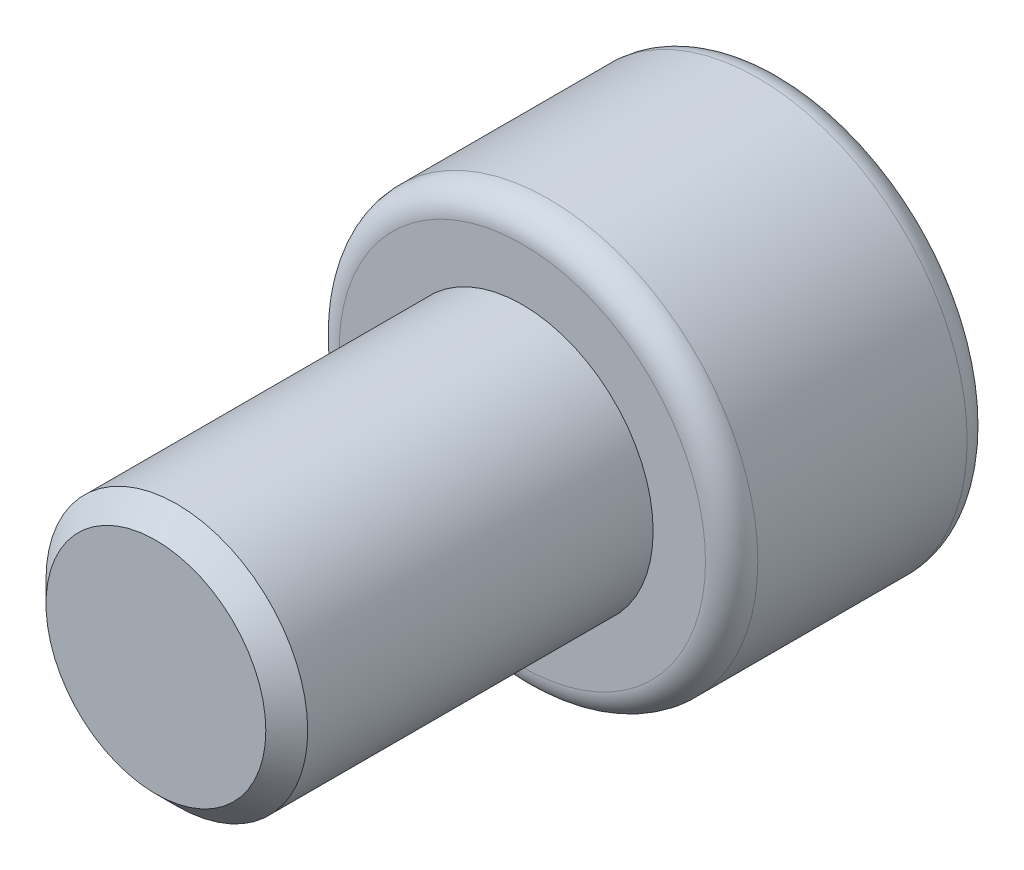
ISO-10303-21;
HEADER;
FILE_DESCRIPTION(('STEP AP214'),'2;1');
FILE_NAME('part.step','',(''),(''),'','','');
FILE_SCHEMA(('AUTOMOTIVE_DESIGN { 1 0 10303 214 1 1 1 1 }'));
ENDSEC;
DATA;
#1=APPLICATION_CONTEXT('core data for automotive mechanical design processes');
#2=APPLICATION_PROTOCOL_DEFINITION('international standard','automotive_design',2000,#1);
#3=PRODUCT_CONTEXT('',#1,'mechanical');
#4=PRODUCT('Part','Part','',(#3));
#5=PRODUCT_RELATED_PRODUCT_CATEGORY('part','',(#4));
#6=PRODUCT_DEFINITION_FORMATION('','',#4);
#7=PRODUCT_DEFINITION_CONTEXT('part definition',#1,'design');
#8=PRODUCT_DEFINITION('design','',#6,#7);
#9=PRODUCT_DEFINITION_SHAPE('','',#8);
#10=(LENGTH_UNIT() NAMED_UNIT(*) SI_UNIT(.MILLI.,.METRE.));
#11=(NAMED_UNIT(*) PLANE_ANGLE_UNIT() SI_UNIT($,.RADIAN.));
#12=(NAMED_UNIT(*) SI_UNIT($,.STERADIAN.) SOLID_ANGLE_UNIT());
#13=UNCERTAINTY_MEASURE_WITH_UNIT(LENGTH_MEASURE(1.E-05),#10,'distance_accuracy_value','');
#14=(GEOMETRIC_REPRESENTATION_CONTEXT(3) GLOBAL_UNCERTAINTY_ASSIGNED_CONTEXT((#13)) GLOBAL_UNIT_ASSIGNED_CONTEXT((#10,
#11,#12)) REPRESENTATION_CONTEXT('',''));
#15=CARTESIAN_POINT('',(0.,0.,0.));
#16=DIRECTION('',(0.,0.,1.));
#17=DIRECTION('',(1.,0.,0.));
#18=AXIS2_PLACEMENT_3D('',#15,#16,#17);
#19=CARTESIAN_POINT('',(0.,0.,5.));
#20=DIRECTION('',(0.,0.,-1.));
#21=DIRECTION('',(-1.,0.,0.));
#22=AXIS2_PLACEMENT_3D('',#19,#20,#21);
#23=CYLINDRICAL_SURFACE('',#22,4.);
#24=CARTESIAN_POINT('',(0.,0.,4.5));
#25=DIRECTION('',(0.,0.,1.));
#26=DIRECTION('',(1.,0.,0.));
#27=AXIS2_PLACEMENT_3D('',#24,#25,#26);
#28=CIRCLE('',#27,4.);
#29=CARTESIAN_POINT('',(4.,0.,4.5));
#30=VERTEX_POINT('',#29);
#31=EDGE_CURVE('E160',#30,#30,#28,.F.);
#32=ORIENTED_EDGE('',*,*,#31,.T.);
#33=EDGE_LOOP('',(#32));
#34=FACE_BOUND('',#33,.T.);
#35=CARTESIAN_POINT('',(0.,0.,0.5));
#36=DIRECTION('',(0.,0.,1.));
#37=DIRECTION('',(1.,0.,0.));
#38=AXIS2_PLACEMENT_3D('',#35,#36,#37);
#39=CIRCLE('',#38,4.);
#40=CARTESIAN_POINT('',(4.,0.,0.5));
#41=VERTEX_POINT('',#40);
#42=EDGE_CURVE('E157',#41,#41,#39,.T.);
#43=ORIENTED_EDGE('',*,*,#42,.T.);
#44=EDGE_LOOP('',(#43));
#45=FACE_BOUND('',#44,.T.);
#46=ADVANCED_FACE('F36',(#34,#45),#23,.T.);
#47=CARTESIAN_POINT('',(0.,0.,5.));
#48=DIRECTION('',(0.,0.,1.));
#49=DIRECTION('',(1.,0.,0.));
#50=AXIS2_PLACEMENT_3D('',#47,#48,#49);
#51=PLANE('',#50);
#52=CARTESIAN_POINT('',(0.,0.,5.));
#53=DIRECTION('',(0.,0.,1.));
#54=DIRECTION('',(1.,0.,0.));
#55=AXIS2_PLACEMENT_3D('',#52,#53,#54);
#56=CIRCLE('',#55,3.5);
#57=CARTESIAN_POINT('',(3.5,0.,5.));
#58=VERTEX_POINT('',#57);
#59=EDGE_CURVE('E154',#58,#58,#56,.T.);
#60=ORIENTED_EDGE('',*,*,#59,.T.);
#61=EDGE_LOOP('',(#60));
#62=FACE_BOUND('',#61,.T.);
#63=CARTESIAN_POINT('',(0.,0.,5.));
#64=DIRECTION('',(0.,0.,1.));
#65=DIRECTION('',(1.,0.,0.));
#66=AXIS2_PLACEMENT_3D('',#63,#64,#65);
#67=CIRCLE('',#66,2.5);
#68=CARTESIAN_POINT('',(2.5,0.,5.));
#69=VERTEX_POINT('',#68);
#70=EDGE_CURVE('E141',#69,#69,#67,.T.);
#71=ORIENTED_EDGE('',*,*,#70,.F.);
#72=EDGE_LOOP('',(#71));
#73=FACE_BOUND('',#72,.T.);
#74=ADVANCED_FACE('F217',(#62,#73),#51,.T.);
#75=CARTESIAN_POINT('',(0.,0.,0.));
#76=DIRECTION('',(0.,0.,1.));
#77=DIRECTION('',(1.,0.,0.));
#78=AXIS2_PLACEMENT_3D('',#75,#76,#77);
#79=PLANE('',#78);
#80=DIRECTION('',(0.,1.,0.));
#81=VECTOR('',#80,1.);
#82=CARTESIAN_POINT('',(-2.2,0.,0.));
#83=LINE('',#82,#81);
#84=CARTESIAN_POINT('',(-2.2,1.27017059221718,0.));
#85=VERTEX_POINT('',#84);
#86=CARTESIAN_POINT('',(-2.2,-1.27017059221718,0.));
#87=VERTEX_POINT('',#86);
#88=EDGE_CURVE('E175',#85,#87,#83,.F.);
#89=ORIENTED_EDGE('',*,*,#88,.T.);
#90=DIRECTION('',(-0.866025403784439,0.5,0.));
#91=VECTOR('',#90,1.);
#92=CARTESIAN_POINT('',(-1.1,-1.90525588832577,0.));
#93=LINE('',#92,#91);
#94=CARTESIAN_POINT('',(0.,-2.54034118443435,0.));
#95=VERTEX_POINT('',#94);
#96=EDGE_CURVE('E179',#87,#95,#93,.F.);
#97=ORIENTED_EDGE('',*,*,#96,.T.);
#98=DIRECTION('',(-0.866025403784439,-0.5,0.));
#99=VECTOR('',#98,1.);
#100=CARTESIAN_POINT('',(1.1,-1.90525588832577,0.));
#101=LINE('',#100,#99);
#102=CARTESIAN_POINT('',(2.2,-1.27017059221718,0.));
#103=VERTEX_POINT('',#102);
#104=EDGE_CURVE('E177',#95,#103,#101,.F.);
#105=ORIENTED_EDGE('',*,*,#104,.T.);
#106=DIRECTION('',(0.,-1.,0.));
#107=VECTOR('',#106,1.);
#108=CARTESIAN_POINT('',(2.2,0.,0.));
#109=LINE('',#108,#107);
#110=CARTESIAN_POINT('',(2.2,1.27017059221718,0.));
#111=VERTEX_POINT('',#110);
#112=EDGE_CURVE('E169',#103,#111,#109,.F.);
#113=ORIENTED_EDGE('',*,*,#112,.T.);
#114=DIRECTION('',(0.866025403784439,-0.5,0.));
#115=VECTOR('',#114,1.);
#116=CARTESIAN_POINT('',(1.1,1.90525588832577,0.));
#117=LINE('',#116,#115);
#118=CARTESIAN_POINT('',(0.,2.54034118443435,0.));
#119=VERTEX_POINT('',#118);
#120=EDGE_CURVE('E171',#111,#119,#117,.F.);
#121=ORIENTED_EDGE('',*,*,#120,.T.);
#122=DIRECTION('',(0.866025403784439,0.5,0.));
#123=VECTOR('',#122,1.);
#124=CARTESIAN_POINT('',(-1.1,1.90525588832577,0.));
#125=LINE('',#124,#123);
#126=EDGE_CURVE('E173',#119,#85,#125,.F.);
#127=ORIENTED_EDGE('',*,*,#126,.T.);
#128=EDGE_LOOP('',(#89,#97,#105,#113,#121,#127));
#129=FACE_BOUND('',#128,.T.);
#130=CARTESIAN_POINT('',(0.,0.,0.));
#131=DIRECTION('',(0.,0.,1.));
#132=DIRECTION('',(1.,0.,0.));
#133=AXIS2_PLACEMENT_3D('',#130,#131,#132);
#134=CIRCLE('',#133,3.5);
#135=CARTESIAN_POINT('',(3.5,0.,0.));
#136=VERTEX_POINT('',#135);
#137=EDGE_CURVE('E163',#136,#136,#134,.F.);
#138=ORIENTED_EDGE('',*,*,#137,.T.);
#139=EDGE_LOOP('',(#138));
#140=FACE_BOUND('',#139,.T.);
#141=ADVANCED_FACE('F223',(#129,#140),#79,.F.);
#142=CARTESIAN_POINT('',(0.,0.,12.));
#143=DIRECTION('',(0.,0.,-1.));
#144=DIRECTION('',(-1.,0.,0.));
#145=AXIS2_PLACEMENT_3D('',#142,#143,#144);
#146=CYLINDRICAL_SURFACE('',#145,2.5);
#147=CARTESIAN_POINT('',(0.,0.,11.6));
#148=DIRECTION('',(0.,0.,1.));
#149=DIRECTION('',(1.,0.,0.));
#150=AXIS2_PLACEMENT_3D('',#147,#148,#149);
#151=CIRCLE('',#150,2.5);
#152=CARTESIAN_POINT('',(2.5,0.,11.6));
#153=VERTEX_POINT('',#152);
#154=EDGE_CURVE('E11',#153,#153,#151,.F.);
#155=ORIENTED_EDGE('',*,*,#154,.T.);
#156=EDGE_LOOP('',(#155));
#157=FACE_BOUND('',#156,.T.);
#158=ORIENTED_EDGE('',*,*,#70,.T.);
#159=EDGE_LOOP('',(#158));
#160=FACE_BOUND('',#159,.T.);
#161=ADVANCED_FACE('F295',(#157,#160),#146,.T.);
#162=CARTESIAN_POINT('',(0.,0.,12.));
#163=DIRECTION('',(0.,0.,1.));
#164=DIRECTION('',(1.,0.,0.));
#165=AXIS2_PLACEMENT_3D('',#162,#163,#164);
#166=PLANE('',#165);
#167=CARTESIAN_POINT('',(0.,0.,12.));
#168=DIRECTION('',(0.,0.,1.));
#169=DIRECTION('',(1.,0.,0.));
#170=AXIS2_PLACEMENT_3D('',#167,#168,#169);
#171=CIRCLE('',#170,2.1);
#172=CARTESIAN_POINT('',(2.1,0.,12.));
#173=VERTEX_POINT('',#172);
#174=EDGE_CURVE('E44',#173,#173,#171,.T.);
#175=ORIENTED_EDGE('',*,*,#174,.T.);
#176=EDGE_LOOP('',(#175));
#177=FACE_BOUND('',#176,.T.);
#178=ADVANCED_FACE('F204',(#177),#166,.T.);
#179=CARTESIAN_POINT('',(-2.,1.15470053837925,3.));
#180=DIRECTION('',(-0.5,0.866025403784439,0.));
#181=DIRECTION('',(-0.866025403784439,-0.5,0.));
#182=AXIS2_PLACEMENT_3D('',#179,#180,#181);
#183=PLANE('',#182);
#184=DIRECTION('',(0.,0.,-1.));
#185=VECTOR('',#184,1.);
#186=CARTESIAN_POINT('',(-2.,1.15470053837925,3.));
#187=LINE('',#186,#185);
#188=CARTESIAN_POINT('',(-2.,1.15470053837925,3.));
#189=VERTEX_POINT('',#188);
#190=CARTESIAN_POINT('',(-2.,1.15470053837925,0.2));
#191=VERTEX_POINT('',#190);
#192=EDGE_CURVE('E139',#189,#191,#187,.T.);
#193=ORIENTED_EDGE('',*,*,#192,.T.);
#194=DIRECTION('',(0.866025403784439,0.5,0.));
#195=VECTOR('',#194,1.);
#196=CARTESIAN_POINT('',(-2.,1.15470053837925,0.2));
#197=LINE('',#196,#195);
#198=CARTESIAN_POINT('',(0.,2.3094010767585,0.2));
#199=VERTEX_POINT('',#198);
#200=EDGE_CURVE('E59',#191,#199,#197,.T.);
#201=ORIENTED_EDGE('',*,*,#200,.T.);
#202=DIRECTION('',(0.,0.,-1.));
#203=VECTOR('',#202,1.);
#204=CARTESIAN_POINT('',(0.,2.3094010767585,3.));
#205=LINE('',#204,#203);
#206=CARTESIAN_POINT('',(0.,2.3094010767585,3.));
#207=VERTEX_POINT('',#206);
#208=EDGE_CURVE('E106',#207,#199,#205,.T.);
#209=ORIENTED_EDGE('',*,*,#208,.F.);
#210=DIRECTION('',(0.866025403784439,0.5,0.));
#211=VECTOR('',#210,1.);
#212=CARTESIAN_POINT('',(-2.,1.15470053837925,3.));
#213=LINE('',#212,#211);
#214=EDGE_CURVE('E110',#189,#207,#213,.T.);
#215=ORIENTED_EDGE('',*,*,#214,.F.);
#216=EDGE_LOOP('',(#193,#201,#209,#215));
#217=FACE_BOUND('',#216,.T.);
#218=ADVANCED_FACE('F108',(#217),#183,.F.);
#219=CARTESIAN_POINT('',(-2.,-1.15470053837925,3.));
#220=DIRECTION('',(-1.,0.,0.));
#221=DIRECTION('',(0.,-1.,0.));
#222=AXIS2_PLACEMENT_3D('',#219,#220,#221);
#223=PLANE('',#222);
#224=DIRECTION('',(0.,0.,-1.));
#225=VECTOR('',#224,1.);
#226=CARTESIAN_POINT('',(-2.,-1.15470053837925,3.));
#227=LINE('',#226,#225);
#228=CARTESIAN_POINT('',(-2.,-1.15470053837925,3.));
#229=VERTEX_POINT('',#228);
#230=CARTESIAN_POINT('',(-2.,-1.15470053837925,0.2));
#231=VERTEX_POINT('',#230);
#232=EDGE_CURVE('E142',#229,#231,#227,.T.);
#233=ORIENTED_EDGE('',*,*,#232,.T.);
#234=DIRECTION('',(0.,1.,0.));
#235=VECTOR('',#234,1.);
#236=CARTESIAN_POINT('',(-2.,-1.15470053837925,0.2));
#237=LINE('',#236,#235);
#238=EDGE_CURVE('E184',#231,#191,#237,.T.);
#239=ORIENTED_EDGE('',*,*,#238,.T.);
#240=ORIENTED_EDGE('',*,*,#192,.F.);
#241=DIRECTION('',(0.,1.,0.));
#242=VECTOR('',#241,1.);
#243=CARTESIAN_POINT('',(-2.,-1.15470053837925,3.));
#244=LINE('',#243,#242);
#245=EDGE_CURVE('E113',#229,#189,#244,.T.);
#246=ORIENTED_EDGE('',*,*,#245,.F.);
#247=EDGE_LOOP('',(#233,#239,#240,#246));
#248=FACE_BOUND('',#247,.T.);
#249=ADVANCED_FACE('F292',(#248),#223,.F.);
#250=CARTESIAN_POINT('',(0.,-2.3094010767585,3.));
#251=DIRECTION('',(-0.5,-0.866025403784439,0.));
#252=DIRECTION('',(0.866025403784439,-0.5,0.));
#253=AXIS2_PLACEMENT_3D('',#250,#251,#252);
#254=PLANE('',#253);
#255=DIRECTION('',(0.,0.,-1.));
#256=VECTOR('',#255,1.);
#257=CARTESIAN_POINT('',(0.,-2.3094010767585,3.));
#258=LINE('',#257,#256);
#259=CARTESIAN_POINT('',(0.,-2.3094010767585,3.));
#260=VERTEX_POINT('',#259);
#261=CARTESIAN_POINT('',(0.,-2.3094010767585,0.2));
#262=VERTEX_POINT('',#261);
#263=EDGE_CURVE('E145',#260,#262,#258,.T.);
#264=ORIENTED_EDGE('',*,*,#263,.T.);
#265=DIRECTION('',(-0.866025403784439,0.5,0.));
#266=VECTOR('',#265,1.);
#267=CARTESIAN_POINT('',(0.,-2.3094010767585,0.2));
#268=LINE('',#267,#266);
#269=EDGE_CURVE('E166',#262,#231,#268,.T.);
#270=ORIENTED_EDGE('',*,*,#269,.T.);
#271=ORIENTED_EDGE('',*,*,#232,.F.);
#272=DIRECTION('',(-0.866025403784439,0.5,0.));
#273=VECTOR('',#272,1.);
#274=CARTESIAN_POINT('',(0.,-2.3094010767585,3.));
#275=LINE('',#274,#273);
#276=EDGE_CURVE('E136',#260,#229,#275,.T.);
#277=ORIENTED_EDGE('',*,*,#276,.F.);
#278=EDGE_LOOP('',(#264,#270,#271,#277));
#279=FACE_BOUND('',#278,.T.);
#280=ADVANCED_FACE('F277',(#279),#254,.F.);
#281=CARTESIAN_POINT('',(2.,-1.15470053837925,3.));
#282=DIRECTION('',(0.5,-0.866025403784439,0.));
#283=DIRECTION('',(0.866025403784439,0.5,0.));
#284=AXIS2_PLACEMENT_3D('',#281,#282,#283);
#285=PLANE('',#284);
#286=DIRECTION('',(0.,0.,-1.));
#287=VECTOR('',#286,1.);
#288=CARTESIAN_POINT('',(2.,-1.15470053837925,3.));
#289=LINE('',#288,#287);
#290=CARTESIAN_POINT('',(2.,-1.15470053837925,3.));
#291=VERTEX_POINT('',#290);
#292=CARTESIAN_POINT('',(2.,-1.15470053837925,0.2));
#293=VERTEX_POINT('',#292);
#294=EDGE_CURVE('E148',#291,#293,#289,.T.);
#295=ORIENTED_EDGE('',*,*,#294,.T.);
#296=DIRECTION('',(-0.866025403784439,-0.5,0.));
#297=VECTOR('',#296,1.);
#298=CARTESIAN_POINT('',(2.,-1.15470053837925,0.2));
#299=LINE('',#298,#297);
#300=EDGE_CURVE('E182',#293,#262,#299,.T.);
#301=ORIENTED_EDGE('',*,*,#300,.T.);
#302=ORIENTED_EDGE('',*,*,#263,.F.);
#303=DIRECTION('',(-0.866025403784439,-0.5,0.));
#304=VECTOR('',#303,1.);
#305=CARTESIAN_POINT('',(2.,-1.15470053837925,3.));
#306=LINE('',#305,#304);
#307=EDGE_CURVE('E133',#291,#260,#306,.T.);
#308=ORIENTED_EDGE('',*,*,#307,.F.);
#309=EDGE_LOOP('',(#295,#301,#302,#308));
#310=FACE_BOUND('',#309,.T.);
#311=ADVANCED_FACE('F273',(#310),#285,.F.);
#312=CARTESIAN_POINT('',(2.,1.15470053837925,3.));
#313=DIRECTION('',(1.,0.,0.));
#314=DIRECTION('',(0.,0.,-1.));
#315=AXIS2_PLACEMENT_3D('',#312,#313,#314);
#316=PLANE('',#315);
#317=DIRECTION('',(0.,0.,-1.));
#318=VECTOR('',#317,1.);
#319=CARTESIAN_POINT('',(2.,1.15470053837925,3.));
#320=LINE('',#319,#318);
#321=CARTESIAN_POINT('',(2.,1.15470053837925,3.));
#322=VERTEX_POINT('',#321);
#323=CARTESIAN_POINT('',(2.,1.15470053837925,0.2));
#324=VERTEX_POINT('',#323);
#325=EDGE_CURVE('E112',#322,#324,#320,.T.);
#326=ORIENTED_EDGE('',*,*,#325,.T.);
#327=DIRECTION('',(0.,-1.,0.));
#328=VECTOR('',#327,1.);
#329=CARTESIAN_POINT('',(2.,1.15470053837925,0.2));
#330=LINE('',#329,#328);
#331=EDGE_CURVE('E188',#324,#293,#330,.T.);
#332=ORIENTED_EDGE('',*,*,#331,.T.);
#333=ORIENTED_EDGE('',*,*,#294,.F.);
#334=DIRECTION('',(0.,-1.,0.));
#335=VECTOR('',#334,1.);
#336=CARTESIAN_POINT('',(2.,1.15470053837925,3.));
#337=LINE('',#336,#335);
#338=EDGE_CURVE('E121',#322,#291,#337,.T.);
#339=ORIENTED_EDGE('',*,*,#338,.F.);
#340=EDGE_LOOP('',(#326,#332,#333,#339));
#341=FACE_BOUND('',#340,.T.);
#342=ADVANCED_FACE('F279',(#341),#316,.F.);
#343=CARTESIAN_POINT('',(0.,2.3094010767585,3.));
#344=DIRECTION('',(0.5,0.866025403784439,0.));
#345=DIRECTION('',(-0.866025403784439,0.5,0.));
#346=AXIS2_PLACEMENT_3D('',#343,#344,#345);
#347=PLANE('',#346);
#348=ORIENTED_EDGE('',*,*,#208,.T.);
#349=DIRECTION('',(0.866025403784439,-0.5,0.));
#350=VECTOR('',#349,1.);
#351=CARTESIAN_POINT('',(0.,2.3094010767585,0.2));
#352=LINE('',#351,#350);
#353=EDGE_CURVE('E51',#199,#324,#352,.T.);
#354=ORIENTED_EDGE('',*,*,#353,.T.);
#355=ORIENTED_EDGE('',*,*,#325,.F.);
#356=DIRECTION('',(0.866025403784439,-0.5,0.));
#357=VECTOR('',#356,1.);
#358=CARTESIAN_POINT('',(0.,2.3094010767585,3.));
#359=LINE('',#358,#357);
#360=EDGE_CURVE('E116',#207,#322,#359,.T.);
#361=ORIENTED_EDGE('',*,*,#360,.F.);
#362=EDGE_LOOP('',(#348,#354,#355,#361));
#363=FACE_BOUND('',#362,.T.);
#364=ADVANCED_FACE('F117',(#363),#347,.F.);
#365=CARTESIAN_POINT('',(0.,0.,3.));
#366=DIRECTION('',(0.,0.,-1.));
#367=DIRECTION('',(-1.,0.,0.));
#368=AXIS2_PLACEMENT_3D('',#365,#366,#367);
#369=PLANE('',#368);
#370=ORIENTED_EDGE('',*,*,#214,.T.);
#371=ORIENTED_EDGE('',*,*,#360,.T.);
#372=ORIENTED_EDGE('',*,*,#338,.T.);
#373=ORIENTED_EDGE('',*,*,#307,.T.);
#374=ORIENTED_EDGE('',*,*,#276,.T.);
#375=ORIENTED_EDGE('',*,*,#245,.T.);
#376=EDGE_LOOP('',(#370,#371,#372,#373,#374,#375));
#377=FACE_BOUND('',#376,.T.);
#378=ADVANCED_FACE('F123',(#377),#369,.T.);
#379=CARTESIAN_POINT('',(0.,0.,4.5));
#380=DIRECTION('',(0.,0.,1.));
#381=DIRECTION('',(1.,0.,0.));
#382=AXIS2_PLACEMENT_3D('',#379,#380,#381);
#383=TOROIDAL_SURFACE('',#382,3.5,0.5);
#384=ORIENTED_EDGE('',*,*,#31,.F.);
#385=EDGE_LOOP('',(#384));
#386=FACE_BOUND('',#385,.T.);
#387=ORIENTED_EDGE('',*,*,#59,.F.);
#388=EDGE_LOOP('',(#387));
#389=FACE_BOUND('',#388,.T.);
#390=ADVANCED_FACE('F229',(#386,#389),#383,.T.);
#391=CARTESIAN_POINT('',(0.,0.,0.5));
#392=DIRECTION('',(0.,0.,1.));
#393=DIRECTION('',(1.,0.,0.));
#394=AXIS2_PLACEMENT_3D('',#391,#392,#393);
#395=TOROIDAL_SURFACE('',#394,3.5,0.5);
#396=ORIENTED_EDGE('',*,*,#137,.F.);
#397=EDGE_LOOP('',(#396));
#398=FACE_BOUND('',#397,.T.);
#399=ORIENTED_EDGE('',*,*,#42,.F.);
#400=EDGE_LOOP('',(#399));
#401=FACE_BOUND('',#400,.T.);
#402=ADVANCED_FACE('F232',(#398,#401),#395,.T.);
#403=CARTESIAN_POINT('',(0.0999999999999995,2.48260615751539,0.2));
#404=DIRECTION('',(0.866025403784439,-0.5,0.));
#405=DIRECTION('',(0.5,0.866025403784439,0.));
#406=AXIS2_PLACEMENT_3D('',#403,#404,#405);
#407=CYLINDRICAL_SURFACE('',#406,0.2);
#408=CARTESIAN_POINT('',(0.,2.54034118443435,0.2));
#409=DIRECTION('',(1.,0.,0.));
#410=DIRECTION('',(0.,1.,0.));
#411=AXIS2_PLACEMENT_3D('',#408,#409,#410);
#412=ELLIPSE('',#411,0.23094010767585,0.2);
#413=EDGE_CURVE('E129',#119,#199,#412,.F.);
#414=ORIENTED_EDGE('',*,*,#413,.F.);
#415=ORIENTED_EDGE('',*,*,#120,.F.);
#416=CARTESIAN_POINT('',(2.2,1.27017059221718,0.2));
#417=DIRECTION('',(0.5,-0.866025403784439,0.));
#418=DIRECTION('',(0.866025403784439,0.5,0.));
#419=AXIS2_PLACEMENT_3D('',#416,#417,#418);
#420=ELLIPSE('',#419,0.23094010767585,0.2);
#421=EDGE_CURVE('E126',#324,#111,#420,.T.);
#422=ORIENTED_EDGE('',*,*,#421,.F.);
#423=ORIENTED_EDGE('',*,*,#353,.F.);
#424=EDGE_LOOP('',(#414,#415,#422,#423));
#425=FACE_BOUND('',#424,.T.);
#426=ADVANCED_FACE('F235',(#425),#407,.T.);
#427=CARTESIAN_POINT('',(2.2,1.15470053837925,0.2));
#428=DIRECTION('',(0.,-1.,0.));
#429=DIRECTION('',(0.,0.,-1.));
#430=AXIS2_PLACEMENT_3D('',#427,#428,#429);
#431=CYLINDRICAL_SURFACE('',#430,0.2);
#432=ORIENTED_EDGE('',*,*,#421,.T.);
#433=ORIENTED_EDGE('',*,*,#112,.F.);
#434=CARTESIAN_POINT('',(2.2,-1.27017059221718,0.2));
#435=DIRECTION('',(-0.5,-0.866025403784439,0.));
#436=DIRECTION('',(-0.866025403784439,0.5,0.));
#437=AXIS2_PLACEMENT_3D('',#434,#435,#436);
#438=ELLIPSE('',#437,0.23094010767585,0.2);
#439=EDGE_CURVE('E197',#293,#103,#438,.T.);
#440=ORIENTED_EDGE('',*,*,#439,.F.);
#441=ORIENTED_EDGE('',*,*,#331,.F.);
#442=EDGE_LOOP('',(#432,#433,#440,#441));
#443=FACE_BOUND('',#442,.T.);
#444=ADVANCED_FACE('F248',(#443),#431,.T.);
#445=CARTESIAN_POINT('',(-2.1,1.32790561913614,0.2));
#446=DIRECTION('',(0.866025403784439,0.5,0.));
#447=DIRECTION('',(-0.5,0.866025403784439,0.));
#448=AXIS2_PLACEMENT_3D('',#445,#446,#447);
#449=CYLINDRICAL_SURFACE('',#448,0.2);
#450=ORIENTED_EDGE('',*,*,#413,.T.);
#451=ORIENTED_EDGE('',*,*,#200,.F.);
#452=CARTESIAN_POINT('',(-2.2,1.27017059221718,0.2));
#453=DIRECTION('',(0.5,0.866025403784438,0.));
#454=DIRECTION('',(-0.866025403784439,0.5,0.));
#455=AXIS2_PLACEMENT_3D('',#452,#453,#454);
#456=ELLIPSE('',#455,0.23094010767585,0.2);
#457=EDGE_CURVE('E194',#85,#191,#456,.F.);
#458=ORIENTED_EDGE('',*,*,#457,.F.);
#459=ORIENTED_EDGE('',*,*,#126,.F.);
#460=EDGE_LOOP('',(#450,#451,#458,#459));
#461=FACE_BOUND('',#460,.T.);
#462=ADVANCED_FACE('F244',(#461),#449,.T.);
#463=CARTESIAN_POINT('',(2.1,-1.32790561913614,0.2));
#464=DIRECTION('',(-0.866025403784439,-0.5,0.));
#465=DIRECTION('',(0.5,-0.866025403784439,0.));
#466=AXIS2_PLACEMENT_3D('',#463,#464,#465);
#467=CYLINDRICAL_SURFACE('',#466,0.2);
#468=ORIENTED_EDGE('',*,*,#439,.T.);
#469=ORIENTED_EDGE('',*,*,#104,.F.);
#470=CARTESIAN_POINT('',(0.,-2.54034118443435,0.2));
#471=DIRECTION('',(-1.,0.,0.));
#472=DIRECTION('',(0.,1.,0.));
#473=AXIS2_PLACEMENT_3D('',#470,#471,#472);
#474=ELLIPSE('',#473,0.23094010767585,0.2);
#475=EDGE_CURVE('E192',#262,#95,#474,.T.);
#476=ORIENTED_EDGE('',*,*,#475,.F.);
#477=ORIENTED_EDGE('',*,*,#300,.F.);
#478=EDGE_LOOP('',(#468,#469,#476,#477));
#479=FACE_BOUND('',#478,.T.);
#480=ADVANCED_FACE('F240',(#479),#467,.T.);
#481=CARTESIAN_POINT('',(-2.2,-1.15470053837925,0.2));
#482=DIRECTION('',(0.,1.,0.));
#483=DIRECTION('',(-1.,0.,0.));
#484=AXIS2_PLACEMENT_3D('',#481,#482,#483);
#485=CYLINDRICAL_SURFACE('',#484,0.2);
#486=ORIENTED_EDGE('',*,*,#457,.T.);
#487=ORIENTED_EDGE('',*,*,#238,.F.);
#488=CARTESIAN_POINT('',(-2.2,-1.27017059221718,0.2));
#489=DIRECTION('',(-0.5,0.866025403784439,0.));
#490=DIRECTION('',(-0.866025403784439,-0.5,0.));
#491=AXIS2_PLACEMENT_3D('',#488,#489,#490);
#492=ELLIPSE('',#491,0.23094010767585,0.2);
#493=EDGE_CURVE('E190',#87,#231,#492,.F.);
#494=ORIENTED_EDGE('',*,*,#493,.F.);
#495=ORIENTED_EDGE('',*,*,#88,.F.);
#496=EDGE_LOOP('',(#486,#487,#494,#495));
#497=FACE_BOUND('',#496,.T.);
#498=ADVANCED_FACE('F212',(#497),#485,.T.);
#499=CARTESIAN_POINT('',(-0.0999999999999999,-2.48260615751539,0.2));
#500=DIRECTION('',(-0.866025403784439,0.5,0.));
#501=DIRECTION('',(-0.5,-0.866025403784439,0.));
#502=AXIS2_PLACEMENT_3D('',#499,#500,#501);
#503=CYLINDRICAL_SURFACE('',#502,0.2);
#504=ORIENTED_EDGE('',*,*,#475,.T.);
#505=ORIENTED_EDGE('',*,*,#96,.F.);
#506=ORIENTED_EDGE('',*,*,#493,.T.);
#507=ORIENTED_EDGE('',*,*,#269,.F.);
#508=EDGE_LOOP('',(#504,#505,#506,#507));
#509=FACE_BOUND('',#508,.T.);
#510=ADVANCED_FACE('F207',(#509),#503,.T.);
#511=CARTESIAN_POINT('',(0.,0.,12.));
#512=DIRECTION('',(0.,0.,-1.));
#513=DIRECTION('',(-1.,0.,0.));
#514=AXIS2_PLACEMENT_3D('',#511,#512,#513);
#515=CONICAL_SURFACE('',#514,2.1,0.78539816339745);
#516=ORIENTED_EDGE('',*,*,#154,.F.);
#517=EDGE_LOOP('',(#516));
#518=FACE_BOUND('',#517,.T.);
#519=ORIENTED_EDGE('',*,*,#174,.F.);
#520=EDGE_LOOP('',(#519));
#521=FACE_BOUND('',#520,.T.);
#522=ADVANCED_FACE('F38',(#518,#521),#515,.T.);
#523=CLOSED_SHELL('',(#46,#74,#141,#161,#178,#218,#249,#280,#311,#342,#364,#378,#390,#402,#426,
#444,#462,#480,#498,#510,#522));
#524=MANIFOLD_SOLID_BREP('B2',#523);
#525=ADVANCED_BREP_SHAPE_REPRESENTATION('',(#18,#524),#14);
#526=SHAPE_DEFINITION_REPRESENTATION(#9,#525);
ENDSEC;
END-ISO-10303-21;
